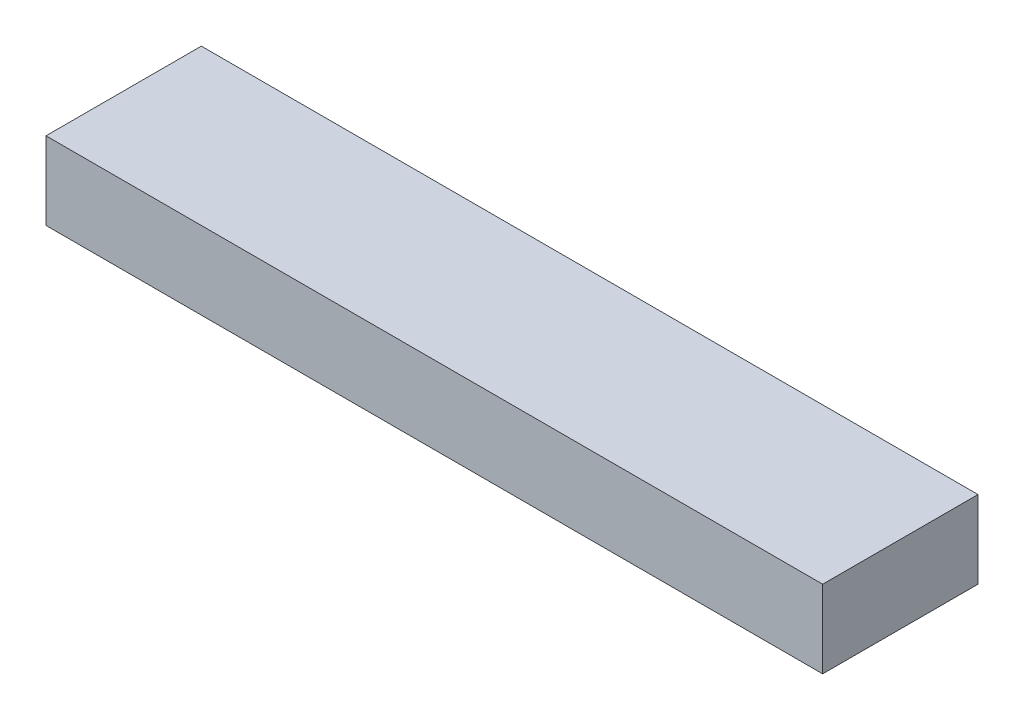
ISO-10303-21;
HEADER;
FILE_DESCRIPTION(('STEP AP214'),'2;1');
FILE_NAME('part.step','',(''),(''),'','','');
FILE_SCHEMA(('AUTOMOTIVE_DESIGN { 1 0 10303 214 1 1 1 1 }'));
ENDSEC;
DATA;
#1=APPLICATION_CONTEXT('core data for automotive mechanical design processes');
#2=APPLICATION_PROTOCOL_DEFINITION('international standard','automotive_design',2000,#1);
#3=PRODUCT_CONTEXT('',#1,'mechanical');
#4=PRODUCT('Part','Part','',(#3));
#5=PRODUCT_RELATED_PRODUCT_CATEGORY('part','',(#4));
#6=PRODUCT_DEFINITION_FORMATION('','',#4);
#7=PRODUCT_DEFINITION_CONTEXT('part definition',#1,'design');
#8=PRODUCT_DEFINITION('design','',#6,#7);
#9=PRODUCT_DEFINITION_SHAPE('','',#8);
#10=(LENGTH_UNIT() NAMED_UNIT(*) SI_UNIT(.MILLI.,.METRE.));
#11=(NAMED_UNIT(*) PLANE_ANGLE_UNIT() SI_UNIT($,.RADIAN.));
#12=(NAMED_UNIT(*) SI_UNIT($,.STERADIAN.) SOLID_ANGLE_UNIT());
#13=UNCERTAINTY_MEASURE_WITH_UNIT(LENGTH_MEASURE(1.E-05),#10,'distance_accuracy_value','');
#14=(GEOMETRIC_REPRESENTATION_CONTEXT(3) GLOBAL_UNCERTAINTY_ASSIGNED_CONTEXT((#13)) GLOBAL_UNIT_ASSIGNED_CONTEXT((#10,
#11,#12)) REPRESENTATION_CONTEXT('',''));
#15=CARTESIAN_POINT('',(0.,0.,0.));
#16=DIRECTION('',(0.,0.,1.));
#17=DIRECTION('',(1.,0.,0.));
#18=AXIS2_PLACEMENT_3D('',#15,#16,#17);
#19=CARTESIAN_POINT('',(0.,0.,20.));
#20=DIRECTION('',(1.,0.,0.));
#21=DIRECTION('',(0.,1.,0.));
#22=AXIS2_PLACEMENT_3D('',#19,#20,#21);
#23=PLANE('',#22);
#24=DIRECTION('',(0.,-1.,0.));
#25=VECTOR('',#24,1.);
#26=CARTESIAN_POINT('',(0.,0.,0.));
#27=LINE('',#26,#25);
#28=CARTESIAN_POINT('',(0.,10.,0.));
#29=VERTEX_POINT('',#28);
#30=CARTESIAN_POINT('',(0.,0.,0.));
#31=VERTEX_POINT('',#30);
#32=EDGE_CURVE('E107',#29,#31,#27,.T.);
#33=ORIENTED_EDGE('',*,*,#32,.T.);
#34=DIRECTION('',(0.,0.,-1.));
#35=VECTOR('',#34,1.);
#36=CARTESIAN_POINT('',(0.,0.,20.));
#37=LINE('',#36,#35);
#38=CARTESIAN_POINT('',(0.,0.,20.));
#39=VERTEX_POINT('',#38);
#40=EDGE_CURVE('E11',#39,#31,#37,.T.);
#41=ORIENTED_EDGE('',*,*,#40,.F.);
#42=DIRECTION('',(0.,-1.,0.));
#43=VECTOR('',#42,1.);
#44=CARTESIAN_POINT('',(0.,0.,20.));
#45=LINE('',#44,#43);
#46=CARTESIAN_POINT('',(0.,10.,20.));
#47=VERTEX_POINT('',#46);
#48=EDGE_CURVE('E91',#47,#39,#45,.T.);
#49=ORIENTED_EDGE('',*,*,#48,.F.);
#50=DIRECTION('',(0.,0.,-1.));
#51=VECTOR('',#50,1.);
#52=CARTESIAN_POINT('',(0.,10.,20.));
#53=LINE('',#52,#51);
#54=EDGE_CURVE('E103',#47,#29,#53,.T.);
#55=ORIENTED_EDGE('',*,*,#54,.T.);
#56=EDGE_LOOP('',(#33,#41,#49,#55));
#57=FACE_BOUND('',#56,.T.);
#58=ADVANCED_FACE('F39',(#57),#23,.F.);
#59=CARTESIAN_POINT('',(0.,0.,20.));
#60=DIRECTION('',(0.,1.,0.));
#61=DIRECTION('',(0.,0.,1.));
#62=AXIS2_PLACEMENT_3D('',#59,#60,#61);
#63=PLANE('',#62);
#64=DIRECTION('',(1.,0.,0.));
#65=VECTOR('',#64,1.);
#66=CARTESIAN_POINT('',(0.,0.,0.));
#67=LINE('',#66,#65);
#68=CARTESIAN_POINT('',(100.,0.,0.));
#69=VERTEX_POINT('',#68);
#70=EDGE_CURVE('E96',#31,#69,#67,.T.);
#71=ORIENTED_EDGE('',*,*,#70,.T.);
#72=DIRECTION('',(0.,0.,-1.));
#73=VECTOR('',#72,1.);
#74=CARTESIAN_POINT('',(100.,0.,20.));
#75=LINE('',#74,#73);
#76=CARTESIAN_POINT('',(100.,0.,20.));
#77=VERTEX_POINT('',#76);
#78=EDGE_CURVE('E48',#77,#69,#75,.T.);
#79=ORIENTED_EDGE('',*,*,#78,.F.);
#80=DIRECTION('',(1.,0.,0.));
#81=VECTOR('',#80,1.);
#82=CARTESIAN_POINT('',(0.,0.,20.));
#83=LINE('',#82,#81);
#84=EDGE_CURVE('E86',#39,#77,#83,.T.);
#85=ORIENTED_EDGE('',*,*,#84,.F.);
#86=ORIENTED_EDGE('',*,*,#40,.T.);
#87=EDGE_LOOP('',(#71,#79,#85,#86));
#88=FACE_BOUND('',#87,.T.);
#89=ADVANCED_FACE('F95',(#88),#63,.F.);
#90=CARTESIAN_POINT('',(100.,0.,20.));
#91=DIRECTION('',(-1.,0.,0.));
#92=DIRECTION('',(0.,-1.,0.));
#93=AXIS2_PLACEMENT_3D('',#90,#91,#92);
#94=PLANE('',#93);
#95=DIRECTION('',(0.,1.,0.));
#96=VECTOR('',#95,1.);
#97=CARTESIAN_POINT('',(100.,0.,0.));
#98=LINE('',#97,#96);
#99=CARTESIAN_POINT('',(100.,10.,0.));
#100=VERTEX_POINT('',#99);
#101=EDGE_CURVE('E73',#69,#100,#98,.T.);
#102=ORIENTED_EDGE('',*,*,#101,.T.);
#103=DIRECTION('',(0.,0.,-1.));
#104=VECTOR('',#103,1.);
#105=CARTESIAN_POINT('',(100.,10.,20.));
#106=LINE('',#105,#104);
#107=CARTESIAN_POINT('',(100.,10.,20.));
#108=VERTEX_POINT('',#107);
#109=EDGE_CURVE('E98',#108,#100,#106,.T.);
#110=ORIENTED_EDGE('',*,*,#109,.F.);
#111=DIRECTION('',(0.,1.,0.));
#112=VECTOR('',#111,1.);
#113=CARTESIAN_POINT('',(100.,0.,20.));
#114=LINE('',#113,#112);
#115=EDGE_CURVE('E89',#77,#108,#114,.T.);
#116=ORIENTED_EDGE('',*,*,#115,.F.);
#117=ORIENTED_EDGE('',*,*,#78,.T.);
#118=EDGE_LOOP('',(#102,#110,#116,#117));
#119=FACE_BOUND('',#118,.T.);
#120=ADVANCED_FACE('F99',(#119),#94,.F.);
#121=CARTESIAN_POINT('',(0.,10.,20.));
#122=DIRECTION('',(0.,-1.,0.));
#123=DIRECTION('',(0.,0.,-1.));
#124=AXIS2_PLACEMENT_3D('',#121,#122,#123);
#125=PLANE('',#124);
#126=DIRECTION('',(-1.,0.,0.));
#127=VECTOR('',#126,1.);
#128=CARTESIAN_POINT('',(0.,10.,0.));
#129=LINE('',#128,#127);
#130=EDGE_CURVE('E79',#100,#29,#129,.T.);
#131=ORIENTED_EDGE('',*,*,#130,.T.);
#132=ORIENTED_EDGE('',*,*,#54,.F.);
#133=DIRECTION('',(-1.,0.,0.));
#134=VECTOR('',#133,1.);
#135=CARTESIAN_POINT('',(0.,10.,20.));
#136=LINE('',#135,#134);
#137=EDGE_CURVE('E56',#108,#47,#136,.T.);
#138=ORIENTED_EDGE('',*,*,#137,.F.);
#139=ORIENTED_EDGE('',*,*,#109,.T.);
#140=EDGE_LOOP('',(#131,#132,#138,#139));
#141=FACE_BOUND('',#140,.T.);
#142=ADVANCED_FACE('F120',(#141),#125,.F.);
#143=CARTESIAN_POINT('',(0.,0.,20.));
#144=DIRECTION('',(0.,0.,-1.));
#145=DIRECTION('',(-1.,0.,0.));
#146=AXIS2_PLACEMENT_3D('',#143,#144,#145);
#147=PLANE('',#146);
#148=ORIENTED_EDGE('',*,*,#48,.T.);
#149=ORIENTED_EDGE('',*,*,#84,.T.);
#150=ORIENTED_EDGE('',*,*,#115,.T.);
#151=ORIENTED_EDGE('',*,*,#137,.T.);
#152=EDGE_LOOP('',(#148,#149,#150,#151));
#153=FACE_BOUND('',#152,.T.);
#154=ADVANCED_FACE('F87',(#153),#147,.F.);
#155=CARTESIAN_POINT('',(0.,0.,0.));
#156=DIRECTION('',(0.,0.,-1.));
#157=DIRECTION('',(-1.,0.,0.));
#158=AXIS2_PLACEMENT_3D('',#155,#156,#157);
#159=PLANE('',#158);
#160=ORIENTED_EDGE('',*,*,#32,.F.);
#161=ORIENTED_EDGE('',*,*,#130,.F.);
#162=ORIENTED_EDGE('',*,*,#101,.F.);
#163=ORIENTED_EDGE('',*,*,#70,.F.);
#164=EDGE_LOOP('',(#160,#161,#162,#163));
#165=FACE_BOUND('',#164,.T.);
#166=ADVANCED_FACE('F123',(#165),#159,.T.);
#167=CLOSED_SHELL('',(#58,#89,#120,#142,#154,#166));
#168=MANIFOLD_SOLID_BREP('B2',#167);
#169=ADVANCED_BREP_SHAPE_REPRESENTATION('',(#18,#168),#14);
#170=SHAPE_DEFINITION_REPRESENTATION(#9,#169);
ENDSEC;
END-ISO-10303-21;
